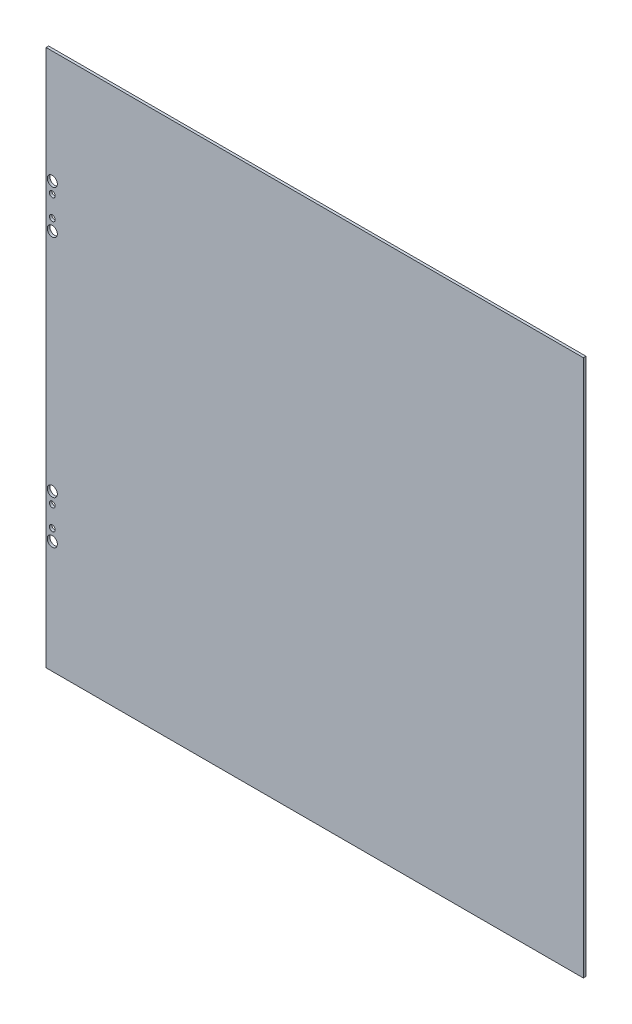
ISO-10303-21;
HEADER;
FILE_DESCRIPTION(('STEP AP214'),'2;1');
FILE_NAME('part.step','',(''),(''),'','','');
FILE_SCHEMA(('AUTOMOTIVE_DESIGN { 1 0 10303 214 1 1 1 1 }'));
ENDSEC;
DATA;
#1=APPLICATION_CONTEXT('core data for automotive mechanical design processes');
#2=APPLICATION_PROTOCOL_DEFINITION('international standard','automotive_design',2000,#1);
#3=PRODUCT_CONTEXT('',#1,'mechanical');
#4=PRODUCT('Part','Part','',(#3));
#5=PRODUCT_RELATED_PRODUCT_CATEGORY('part','',(#4));
#6=PRODUCT_DEFINITION_FORMATION('','',#4);
#7=PRODUCT_DEFINITION_CONTEXT('part definition',#1,'design');
#8=PRODUCT_DEFINITION('design','',#6,#7);
#9=PRODUCT_DEFINITION_SHAPE('','',#8);
#10=(LENGTH_UNIT() NAMED_UNIT(*) SI_UNIT(.MILLI.,.METRE.));
#11=(NAMED_UNIT(*) PLANE_ANGLE_UNIT() SI_UNIT($,.RADIAN.));
#12=(NAMED_UNIT(*) SI_UNIT($,.STERADIAN.) SOLID_ANGLE_UNIT());
#13=UNCERTAINTY_MEASURE_WITH_UNIT(LENGTH_MEASURE(1.E-05),#10,'distance_accuracy_value','');
#14=(GEOMETRIC_REPRESENTATION_CONTEXT(3) GLOBAL_UNCERTAINTY_ASSIGNED_CONTEXT((#13)) GLOBAL_UNIT_ASSIGNED_CONTEXT((#10,
#11,#12)) REPRESENTATION_CONTEXT('',''));
#15=CARTESIAN_POINT('',(0.,0.,0.));
#16=DIRECTION('',(0.,0.,1.));
#17=DIRECTION('',(1.,0.,0.));
#18=AXIS2_PLACEMENT_3D('',#15,#16,#17);
#19=CARTESIAN_POINT('',(0.,0.,3.175));
#20=DIRECTION('',(0.,0.,-1.));
#21=DIRECTION('',(-1.,0.,0.));
#22=AXIS2_PLACEMENT_3D('',#19,#20,#21);
#23=PLANE('',#22);
#24=DIRECTION('',(0.,-1.,0.));
#25=VECTOR('',#24,1.);
#26=CARTESIAN_POINT('',(0.,0.,3.175));
#27=LINE('',#26,#25);
#28=CARTESIAN_POINT('',(0.,660.4,3.175));
#29=VERTEX_POINT('',#28);
#30=CARTESIAN_POINT('',(0.,0.,3.175));
#31=VERTEX_POINT('',#30);
#32=EDGE_CURVE('E85',#29,#31,#27,.T.);
#33=ORIENTED_EDGE('',*,*,#32,.T.);
#34=DIRECTION('',(1.,0.,0.));
#35=VECTOR('',#34,1.);
#36=CARTESIAN_POINT('',(0.,0.,3.175));
#37=LINE('',#36,#35);
#38=CARTESIAN_POINT('',(660.4,0.,3.175));
#39=VERTEX_POINT('',#38);
#40=EDGE_CURVE('E80',#31,#39,#37,.T.);
#41=ORIENTED_EDGE('',*,*,#40,.T.);
#42=DIRECTION('',(0.,1.,0.));
#43=VECTOR('',#42,1.);
#44=CARTESIAN_POINT('',(660.4,0.,3.175));
#45=LINE('',#44,#43);
#46=CARTESIAN_POINT('',(660.4,660.4,3.175));
#47=VERTEX_POINT('',#46);
#48=EDGE_CURVE('E83',#39,#47,#45,.T.);
#49=ORIENTED_EDGE('',*,*,#48,.T.);
#50=DIRECTION('',(-1.,0.,0.));
#51=VECTOR('',#50,1.);
#52=CARTESIAN_POINT('',(0.,660.4,3.175));
#53=LINE('',#52,#51);
#54=EDGE_CURVE('E50',#47,#29,#53,.T.);
#55=ORIENTED_EDGE('',*,*,#54,.T.);
#56=EDGE_LOOP('',(#33,#41,#49,#55));
#57=FACE_BOUND('',#56,.T.);
#58=CARTESIAN_POINT('',(7.62,508.,3.175));
#59=DIRECTION('',(0.,0.,1.));
#60=DIRECTION('',(1.,0.,0.));
#61=AXIS2_PLACEMENT_3D('',#58,#59,#60);
#62=CIRCLE('',#61,3.55600000000001);
#63=CARTESIAN_POINT('',(11.176,508.,3.175));
#64=VERTEX_POINT('',#63);
#65=EDGE_CURVE('E100',#64,#64,#62,.T.);
#66=ORIENTED_EDGE('',*,*,#65,.F.);
#67=EDGE_LOOP('',(#66));
#68=FACE_BOUND('',#67,.T.);
#69=CARTESIAN_POINT('',(7.62,482.6,3.175));
#70=DIRECTION('',(0.,0.,1.));
#71=DIRECTION('',(1.,0.,0.));
#72=AXIS2_PLACEMENT_3D('',#69,#70,#71);
#73=CIRCLE('',#72,3.55599999999999);
#74=CARTESIAN_POINT('',(11.176,482.6,3.175));
#75=VERTEX_POINT('',#74);
#76=EDGE_CURVE('E115',#75,#75,#73,.T.);
#77=ORIENTED_EDGE('',*,*,#76,.F.);
#78=EDGE_LOOP('',(#77));
#79=FACE_BOUND('',#78,.T.);
#80=CARTESIAN_POINT('',(7.62,177.8,3.175));
#81=DIRECTION('',(0.,0.,1.));
#82=DIRECTION('',(1.,0.,0.));
#83=AXIS2_PLACEMENT_3D('',#80,#81,#82);
#84=CIRCLE('',#83,3.556);
#85=CARTESIAN_POINT('',(11.176,177.8,3.175));
#86=VERTEX_POINT('',#85);
#87=EDGE_CURVE('E121',#86,#86,#84,.T.);
#88=ORIENTED_EDGE('',*,*,#87,.F.);
#89=EDGE_LOOP('',(#88));
#90=FACE_BOUND('',#89,.T.);
#91=CARTESIAN_POINT('',(7.62,152.4,3.175));
#92=DIRECTION('',(0.,0.,1.));
#93=DIRECTION('',(1.,0.,0.));
#94=AXIS2_PLACEMENT_3D('',#91,#92,#93);
#95=CIRCLE('',#94,3.556);
#96=CARTESIAN_POINT('',(11.176,152.4,3.175));
#97=VERTEX_POINT('',#96);
#98=EDGE_CURVE('E127',#97,#97,#95,.T.);
#99=ORIENTED_EDGE('',*,*,#98,.F.);
#100=EDGE_LOOP('',(#99));
#101=FACE_BOUND('',#100,.T.);
#102=CARTESIAN_POINT('',(7.62,521.97,3.175));
#103=DIRECTION('',(0.,0.,1.));
#104=DIRECTION('',(1.,0.,0.));
#105=AXIS2_PLACEMENT_3D('',#102,#103,#104);
#106=CIRCLE('',#105,6.1976);
#107=CARTESIAN_POINT('',(13.8176,521.97,3.175));
#108=VERTEX_POINT('',#107);
#109=EDGE_CURVE('E133',#108,#108,#106,.T.);
#110=ORIENTED_EDGE('',*,*,#109,.F.);
#111=EDGE_LOOP('',(#110));
#112=FACE_BOUND('',#111,.T.);
#113=CARTESIAN_POINT('',(7.62,468.63,3.175));
#114=DIRECTION('',(0.,0.,1.));
#115=DIRECTION('',(1.,0.,0.));
#116=AXIS2_PLACEMENT_3D('',#113,#114,#115);
#117=CIRCLE('',#116,6.1976);
#118=CARTESIAN_POINT('',(13.8176,468.63,3.175));
#119=VERTEX_POINT('',#118);
#120=EDGE_CURVE('E139',#119,#119,#117,.T.);
#121=ORIENTED_EDGE('',*,*,#120,.F.);
#122=EDGE_LOOP('',(#121));
#123=FACE_BOUND('',#122,.T.);
#124=CARTESIAN_POINT('',(7.62,191.77,3.175));
#125=DIRECTION('',(0.,0.,1.));
#126=DIRECTION('',(1.,0.,0.));
#127=AXIS2_PLACEMENT_3D('',#124,#125,#126);
#128=CIRCLE('',#127,6.1976);
#129=CARTESIAN_POINT('',(13.8176,191.77,3.175));
#130=VERTEX_POINT('',#129);
#131=EDGE_CURVE('E145',#130,#130,#128,.T.);
#132=ORIENTED_EDGE('',*,*,#131,.F.);
#133=EDGE_LOOP('',(#132));
#134=FACE_BOUND('',#133,.T.);
#135=CARTESIAN_POINT('',(7.62,138.43,3.175));
#136=DIRECTION('',(0.,0.,1.));
#137=DIRECTION('',(1.,0.,0.));
#138=AXIS2_PLACEMENT_3D('',#135,#136,#137);
#139=CIRCLE('',#138,6.1976);
#140=CARTESIAN_POINT('',(13.8176,138.43,3.175));
#141=VERTEX_POINT('',#140);
#142=EDGE_CURVE('E151',#141,#141,#139,.T.);
#143=ORIENTED_EDGE('',*,*,#142,.F.);
#144=EDGE_LOOP('',(#143));
#145=FACE_BOUND('',#144,.T.);
#146=ADVANCED_FACE('F33',(#57,#68,#79,#90,#101,#112,#123,#134,#145),#23,.F.);
#147=CARTESIAN_POINT('',(0.,0.,0.));
#148=DIRECTION('',(0.,0.,-1.));
#149=DIRECTION('',(-1.,0.,0.));
#150=AXIS2_PLACEMENT_3D('',#147,#148,#149);
#151=PLANE('',#150);
#152=CARTESIAN_POINT('',(7.62,191.77,0.));
#153=DIRECTION('',(0.,0.,1.));
#154=DIRECTION('',(1.,0.,0.));
#155=AXIS2_PLACEMENT_3D('',#152,#153,#154);
#156=CIRCLE('',#155,6.1976);
#157=CARTESIAN_POINT('',(13.8176,191.77,0.));
#158=VERTEX_POINT('',#157);
#159=EDGE_CURVE('E148',#158,#158,#156,.T.);
#160=ORIENTED_EDGE('',*,*,#159,.T.);
#161=EDGE_LOOP('',(#160));
#162=FACE_BOUND('',#161,.T.);
#163=CARTESIAN_POINT('',(7.62,521.97,0.));
#164=DIRECTION('',(0.,0.,1.));
#165=DIRECTION('',(1.,0.,0.));
#166=AXIS2_PLACEMENT_3D('',#163,#164,#165);
#167=CIRCLE('',#166,6.1976);
#168=CARTESIAN_POINT('',(13.8176,521.97,0.));
#169=VERTEX_POINT('',#168);
#170=EDGE_CURVE('E136',#169,#169,#167,.T.);
#171=ORIENTED_EDGE('',*,*,#170,.T.);
#172=EDGE_LOOP('',(#171));
#173=FACE_BOUND('',#172,.T.);
#174=CARTESIAN_POINT('',(7.62,177.8,0.));
#175=DIRECTION('',(0.,0.,1.));
#176=DIRECTION('',(1.,0.,0.));
#177=AXIS2_PLACEMENT_3D('',#174,#175,#176);
#178=CIRCLE('',#177,3.556);
#179=CARTESIAN_POINT('',(11.176,177.8,0.));
#180=VERTEX_POINT('',#179);
#181=EDGE_CURVE('E124',#180,#180,#178,.T.);
#182=ORIENTED_EDGE('',*,*,#181,.T.);
#183=EDGE_LOOP('',(#182));
#184=FACE_BOUND('',#183,.T.);
#185=CARTESIAN_POINT('',(7.62,508.,0.));
#186=DIRECTION('',(0.,0.,1.));
#187=DIRECTION('',(1.,0.,0.));
#188=AXIS2_PLACEMENT_3D('',#185,#186,#187);
#189=CIRCLE('',#188,3.55600000000001);
#190=CARTESIAN_POINT('',(11.176,508.,0.));
#191=VERTEX_POINT('',#190);
#192=EDGE_CURVE('E112',#191,#191,#189,.T.);
#193=ORIENTED_EDGE('',*,*,#192,.T.);
#194=EDGE_LOOP('',(#193));
#195=FACE_BOUND('',#194,.T.);
#196=DIRECTION('',(0.,-1.,0.));
#197=VECTOR('',#196,1.);
#198=CARTESIAN_POINT('',(0.,0.,0.));
#199=LINE('',#198,#197);
#200=CARTESIAN_POINT('',(0.,660.4,0.));
#201=VERTEX_POINT('',#200);
#202=CARTESIAN_POINT('',(0.,0.,0.));
#203=VERTEX_POINT('',#202);
#204=EDGE_CURVE('E97',#201,#203,#199,.T.);
#205=ORIENTED_EDGE('',*,*,#204,.F.);
#206=DIRECTION('',(-1.,0.,0.));
#207=VECTOR('',#206,1.);
#208=CARTESIAN_POINT('',(0.,660.4,0.));
#209=LINE('',#208,#207);
#210=CARTESIAN_POINT('',(660.4,660.4,0.));
#211=VERTEX_POINT('',#210);
#212=EDGE_CURVE('E73',#211,#201,#209,.T.);
#213=ORIENTED_EDGE('',*,*,#212,.F.);
#214=DIRECTION('',(0.,1.,0.));
#215=VECTOR('',#214,1.);
#216=CARTESIAN_POINT('',(660.4,0.,0.));
#217=LINE('',#216,#215);
#218=CARTESIAN_POINT('',(660.4,0.,0.));
#219=VERTEX_POINT('',#218);
#220=EDGE_CURVE('E67',#219,#211,#217,.T.);
#221=ORIENTED_EDGE('',*,*,#220,.F.);
#222=DIRECTION('',(1.,0.,0.));
#223=VECTOR('',#222,1.);
#224=CARTESIAN_POINT('',(0.,0.,0.));
#225=LINE('',#224,#223);
#226=EDGE_CURVE('E89',#203,#219,#225,.T.);
#227=ORIENTED_EDGE('',*,*,#226,.F.);
#228=EDGE_LOOP('',(#205,#213,#221,#227));
#229=FACE_BOUND('',#228,.T.);
#230=CARTESIAN_POINT('',(7.62,482.6,0.));
#231=DIRECTION('',(0.,0.,1.));
#232=DIRECTION('',(1.,0.,0.));
#233=AXIS2_PLACEMENT_3D('',#230,#231,#232);
#234=CIRCLE('',#233,3.55599999999999);
#235=CARTESIAN_POINT('',(11.176,482.6,0.));
#236=VERTEX_POINT('',#235);
#237=EDGE_CURVE('E118',#236,#236,#234,.T.);
#238=ORIENTED_EDGE('',*,*,#237,.T.);
#239=EDGE_LOOP('',(#238));
#240=FACE_BOUND('',#239,.T.);
#241=CARTESIAN_POINT('',(7.62,152.4,0.));
#242=DIRECTION('',(0.,0.,1.));
#243=DIRECTION('',(1.,0.,0.));
#244=AXIS2_PLACEMENT_3D('',#241,#242,#243);
#245=CIRCLE('',#244,3.556);
#246=CARTESIAN_POINT('',(11.176,152.4,0.));
#247=VERTEX_POINT('',#246);
#248=EDGE_CURVE('E130',#247,#247,#245,.T.);
#249=ORIENTED_EDGE('',*,*,#248,.T.);
#250=EDGE_LOOP('',(#249));
#251=FACE_BOUND('',#250,.T.);
#252=CARTESIAN_POINT('',(7.62,468.63,0.));
#253=DIRECTION('',(0.,0.,1.));
#254=DIRECTION('',(1.,0.,0.));
#255=AXIS2_PLACEMENT_3D('',#252,#253,#254);
#256=CIRCLE('',#255,6.1976);
#257=CARTESIAN_POINT('',(13.8176,468.63,0.));
#258=VERTEX_POINT('',#257);
#259=EDGE_CURVE('E142',#258,#258,#256,.T.);
#260=ORIENTED_EDGE('',*,*,#259,.T.);
#261=EDGE_LOOP('',(#260));
#262=FACE_BOUND('',#261,.T.);
#263=CARTESIAN_POINT('',(7.62,138.43,0.));
#264=DIRECTION('',(0.,0.,1.));
#265=DIRECTION('',(1.,0.,0.));
#266=AXIS2_PLACEMENT_3D('',#263,#264,#265);
#267=CIRCLE('',#266,6.1976);
#268=CARTESIAN_POINT('',(13.8176,138.43,0.));
#269=VERTEX_POINT('',#268);
#270=EDGE_CURVE('E154',#269,#269,#267,.T.);
#271=ORIENTED_EDGE('',*,*,#270,.T.);
#272=EDGE_LOOP('',(#271));
#273=FACE_BOUND('',#272,.T.);
#274=ADVANCED_FACE('F108',(#162,#173,#184,#195,#229,#240,#251,#262,#273),#151,.T.);
#275=CARTESIAN_POINT('',(0.,0.,3.175));
#276=DIRECTION('',(1.,0.,0.));
#277=DIRECTION('',(0.,0.,-1.));
#278=AXIS2_PLACEMENT_3D('',#275,#276,#277);
#279=PLANE('',#278);
#280=ORIENTED_EDGE('',*,*,#204,.T.);
#281=DIRECTION('',(0.,0.,-1.));
#282=VECTOR('',#281,1.);
#283=CARTESIAN_POINT('',(0.,0.,3.175));
#284=LINE('',#283,#282);
#285=EDGE_CURVE('E11',#31,#203,#284,.T.);
#286=ORIENTED_EDGE('',*,*,#285,.F.);
#287=ORIENTED_EDGE('',*,*,#32,.F.);
#288=DIRECTION('',(0.,0.,-1.));
#289=VECTOR('',#288,1.);
#290=CARTESIAN_POINT('',(0.,660.4,3.175));
#291=LINE('',#290,#289);
#292=EDGE_CURVE('E93',#29,#201,#291,.T.);
#293=ORIENTED_EDGE('',*,*,#292,.T.);
#294=EDGE_LOOP('',(#280,#286,#287,#293));
#295=FACE_BOUND('',#294,.T.);
#296=ADVANCED_FACE('F35',(#295),#279,.F.);
#297=CARTESIAN_POINT('',(0.,0.,3.175));
#298=DIRECTION('',(0.,1.,0.));
#299=DIRECTION('',(0.,0.,1.));
#300=AXIS2_PLACEMENT_3D('',#297,#298,#299);
#301=PLANE('',#300);
#302=ORIENTED_EDGE('',*,*,#226,.T.);
#303=DIRECTION('',(0.,0.,-1.));
#304=VECTOR('',#303,1.);
#305=CARTESIAN_POINT('',(660.4,0.,3.175));
#306=LINE('',#305,#304);
#307=EDGE_CURVE('E42',#39,#219,#306,.T.);
#308=ORIENTED_EDGE('',*,*,#307,.F.);
#309=ORIENTED_EDGE('',*,*,#40,.F.);
#310=ORIENTED_EDGE('',*,*,#285,.T.);
#311=EDGE_LOOP('',(#302,#308,#309,#310));
#312=FACE_BOUND('',#311,.T.);
#313=ADVANCED_FACE('F88',(#312),#301,.F.);
#314=CARTESIAN_POINT('',(660.4,0.,3.175));
#315=DIRECTION('',(-1.,0.,0.));
#316=DIRECTION('',(0.,0.,1.));
#317=AXIS2_PLACEMENT_3D('',#314,#315,#316);
#318=PLANE('',#317);
#319=ORIENTED_EDGE('',*,*,#220,.T.);
#320=DIRECTION('',(0.,0.,-1.));
#321=VECTOR('',#320,1.);
#322=CARTESIAN_POINT('',(660.4,660.4,3.175));
#323=LINE('',#322,#321);
#324=EDGE_CURVE('E90',#47,#211,#323,.T.);
#325=ORIENTED_EDGE('',*,*,#324,.F.);
#326=ORIENTED_EDGE('',*,*,#48,.F.);
#327=ORIENTED_EDGE('',*,*,#307,.T.);
#328=EDGE_LOOP('',(#319,#325,#326,#327));
#329=FACE_BOUND('',#328,.T.);
#330=ADVANCED_FACE('F91',(#329),#318,.F.);
#331=CARTESIAN_POINT('',(0.,660.4,3.175));
#332=DIRECTION('',(0.,-1.,0.));
#333=DIRECTION('',(0.,0.,-1.));
#334=AXIS2_PLACEMENT_3D('',#331,#332,#333);
#335=PLANE('',#334);
#336=ORIENTED_EDGE('',*,*,#212,.T.);
#337=ORIENTED_EDGE('',*,*,#292,.F.);
#338=ORIENTED_EDGE('',*,*,#54,.F.);
#339=ORIENTED_EDGE('',*,*,#324,.T.);
#340=EDGE_LOOP('',(#336,#337,#338,#339));
#341=FACE_BOUND('',#340,.T.);
#342=ADVANCED_FACE('F105',(#341),#335,.F.);
#343=CARTESIAN_POINT('',(7.62,508.,3.175));
#344=DIRECTION('',(0.,0.,-1.));
#345=DIRECTION('',(-1.,0.,0.));
#346=AXIS2_PLACEMENT_3D('',#343,#344,#345);
#347=CYLINDRICAL_SURFACE('',#346,3.55600000000001);
#348=ORIENTED_EDGE('',*,*,#65,.T.);
#349=EDGE_LOOP('',(#348));
#350=FACE_BOUND('',#349,.T.);
#351=ORIENTED_EDGE('',*,*,#192,.F.);
#352=EDGE_LOOP('',(#351));
#353=FACE_BOUND('',#352,.T.);
#354=ADVANCED_FACE('F171',(#350,#353),#347,.F.);
#355=CARTESIAN_POINT('',(7.62,482.6,3.175));
#356=DIRECTION('',(0.,0.,-1.));
#357=DIRECTION('',(-1.,0.,0.));
#358=AXIS2_PLACEMENT_3D('',#355,#356,#357);
#359=CYLINDRICAL_SURFACE('',#358,3.55599999999999);
#360=ORIENTED_EDGE('',*,*,#76,.T.);
#361=EDGE_LOOP('',(#360));
#362=FACE_BOUND('',#361,.T.);
#363=ORIENTED_EDGE('',*,*,#237,.F.);
#364=EDGE_LOOP('',(#363));
#365=FACE_BOUND('',#364,.T.);
#366=ADVANCED_FACE('F217',(#362,#365),#359,.F.);
#367=CARTESIAN_POINT('',(7.62,177.8,3.175));
#368=DIRECTION('',(0.,0.,-1.));
#369=DIRECTION('',(-1.,0.,0.));
#370=AXIS2_PLACEMENT_3D('',#367,#368,#369);
#371=CYLINDRICAL_SURFACE('',#370,3.556);
#372=ORIENTED_EDGE('',*,*,#87,.T.);
#373=EDGE_LOOP('',(#372));
#374=FACE_BOUND('',#373,.T.);
#375=ORIENTED_EDGE('',*,*,#181,.F.);
#376=EDGE_LOOP('',(#375));
#377=FACE_BOUND('',#376,.T.);
#378=ADVANCED_FACE('F225',(#374,#377),#371,.F.);
#379=CARTESIAN_POINT('',(7.62,152.4,3.175));
#380=DIRECTION('',(0.,0.,-1.));
#381=DIRECTION('',(-1.,0.,0.));
#382=AXIS2_PLACEMENT_3D('',#379,#380,#381);
#383=CYLINDRICAL_SURFACE('',#382,3.556);
#384=ORIENTED_EDGE('',*,*,#98,.T.);
#385=EDGE_LOOP('',(#384));
#386=FACE_BOUND('',#385,.T.);
#387=ORIENTED_EDGE('',*,*,#248,.F.);
#388=EDGE_LOOP('',(#387));
#389=FACE_BOUND('',#388,.T.);
#390=ADVANCED_FACE('F233',(#386,#389),#383,.F.);
#391=CARTESIAN_POINT('',(7.62,521.97,3.175));
#392=DIRECTION('',(0.,0.,-1.));
#393=DIRECTION('',(-1.,0.,0.));
#394=AXIS2_PLACEMENT_3D('',#391,#392,#393);
#395=CYLINDRICAL_SURFACE('',#394,6.1976);
#396=ORIENTED_EDGE('',*,*,#109,.T.);
#397=EDGE_LOOP('',(#396));
#398=FACE_BOUND('',#397,.T.);
#399=ORIENTED_EDGE('',*,*,#170,.F.);
#400=EDGE_LOOP('',(#399));
#401=FACE_BOUND('',#400,.T.);
#402=ADVANCED_FACE('F242',(#398,#401),#395,.F.);
#403=CARTESIAN_POINT('',(7.62,468.63,3.175));
#404=DIRECTION('',(0.,0.,-1.));
#405=DIRECTION('',(-1.,0.,0.));
#406=AXIS2_PLACEMENT_3D('',#403,#404,#405);
#407=CYLINDRICAL_SURFACE('',#406,6.1976);
#408=ORIENTED_EDGE('',*,*,#120,.T.);
#409=EDGE_LOOP('',(#408));
#410=FACE_BOUND('',#409,.T.);
#411=ORIENTED_EDGE('',*,*,#259,.F.);
#412=EDGE_LOOP('',(#411));
#413=FACE_BOUND('',#412,.T.);
#414=ADVANCED_FACE('F251',(#410,#413),#407,.F.);
#415=CARTESIAN_POINT('',(7.62,191.77,3.175));
#416=DIRECTION('',(0.,0.,-1.));
#417=DIRECTION('',(-1.,0.,0.));
#418=AXIS2_PLACEMENT_3D('',#415,#416,#417);
#419=CYLINDRICAL_SURFACE('',#418,6.1976);
#420=ORIENTED_EDGE('',*,*,#131,.T.);
#421=EDGE_LOOP('',(#420));
#422=FACE_BOUND('',#421,.T.);
#423=ORIENTED_EDGE('',*,*,#159,.F.);
#424=EDGE_LOOP('',(#423));
#425=FACE_BOUND('',#424,.T.);
#426=ADVANCED_FACE('F260',(#422,#425),#419,.F.);
#427=CARTESIAN_POINT('',(7.62,138.43,3.175));
#428=DIRECTION('',(0.,0.,-1.));
#429=DIRECTION('',(-1.,0.,0.));
#430=AXIS2_PLACEMENT_3D('',#427,#428,#429);
#431=CYLINDRICAL_SURFACE('',#430,6.1976);
#432=ORIENTED_EDGE('',*,*,#142,.T.);
#433=EDGE_LOOP('',(#432));
#434=FACE_BOUND('',#433,.T.);
#435=ORIENTED_EDGE('',*,*,#270,.F.);
#436=EDGE_LOOP('',(#435));
#437=FACE_BOUND('',#436,.T.);
#438=ADVANCED_FACE('F160',(#434,#437),#431,.F.);
#439=CLOSED_SHELL('',(#146,#274,#296,#313,#330,#342,#354,#366,#378,#390,#402,#414,#426,#438));
#440=MANIFOLD_SOLID_BREP('B2',#439);
#441=ADVANCED_BREP_SHAPE_REPRESENTATION('',(#18,#440),#14);
#442=SHAPE_DEFINITION_REPRESENTATION(#9,#441);
ENDSEC;
END-ISO-10303-21;
